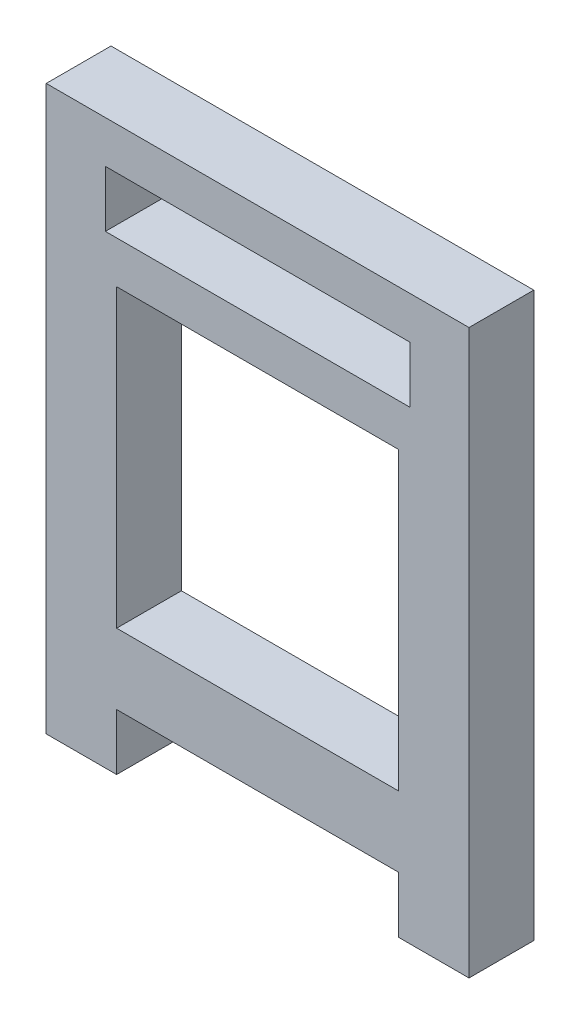
ISO-10303-21;
HEADER;
FILE_DESCRIPTION(('STEP AP214'),'2;1');
FILE_NAME('part.step','',(''),(''),'','','');
FILE_SCHEMA(('AUTOMOTIVE_DESIGN { 1 0 10303 214 1 1 1 1 }'));
ENDSEC;
DATA;
#1=APPLICATION_CONTEXT('core data for automotive mechanical design processes');
#2=APPLICATION_PROTOCOL_DEFINITION('international standard','automotive_design',2000,#1);
#3=PRODUCT_CONTEXT('',#1,'mechanical');
#4=PRODUCT('Part','Part','',(#3));
#5=PRODUCT_RELATED_PRODUCT_CATEGORY('part','',(#4));
#6=PRODUCT_DEFINITION_FORMATION('','',#4);
#7=PRODUCT_DEFINITION_CONTEXT('part definition',#1,'design');
#8=PRODUCT_DEFINITION('design','',#6,#7);
#9=PRODUCT_DEFINITION_SHAPE('','',#8);
#10=(LENGTH_UNIT() NAMED_UNIT(*) SI_UNIT(.MILLI.,.METRE.));
#11=(NAMED_UNIT(*) PLANE_ANGLE_UNIT() SI_UNIT($,.RADIAN.));
#12=(NAMED_UNIT(*) SI_UNIT($,.STERADIAN.) SOLID_ANGLE_UNIT());
#13=UNCERTAINTY_MEASURE_WITH_UNIT(LENGTH_MEASURE(1.E-05),#10,'distance_accuracy_value','');
#14=(GEOMETRIC_REPRESENTATION_CONTEXT(3) GLOBAL_UNCERTAINTY_ASSIGNED_CONTEXT((#13)) GLOBAL_UNIT_ASSIGNED_CONTEXT((#10,
#11,#12)) REPRESENTATION_CONTEXT('',''));
#15=CARTESIAN_POINT('',(0.,0.,0.));
#16=DIRECTION('',(0.,0.,1.));
#17=DIRECTION('',(1.,0.,0.));
#18=AXIS2_PLACEMENT_3D('',#15,#16,#17);
#19=CARTESIAN_POINT('',(0.,0.,2.3));
#20=DIRECTION('',(0.,0.,-1.));
#21=DIRECTION('',(-1.,0.,0.));
#22=AXIS2_PLACEMENT_3D('',#19,#20,#21);
#23=PLANE('',#22);
#24=DIRECTION('',(0.,1.,0.));
#25=VECTOR('',#24,1.);
#26=CARTESIAN_POINT('',(12.51,2.5,2.3));
#27=LINE('',#26,#25);
#28=CARTESIAN_POINT('',(12.51,2.5,2.3));
#29=VERTEX_POINT('',#28);
#30=CARTESIAN_POINT('',(12.51,13.,2.3));
#31=VERTEX_POINT('',#30);
#32=EDGE_CURVE('E188',#29,#31,#27,.T.);
#33=ORIENTED_EDGE('',*,*,#32,.F.);
#34=DIRECTION('',(1.,0.,0.));
#35=VECTOR('',#34,1.);
#36=CARTESIAN_POINT('',(2.5,2.5,2.3));
#37=LINE('',#36,#35);
#38=CARTESIAN_POINT('',(2.5,2.5,2.3));
#39=VERTEX_POINT('',#38);
#40=EDGE_CURVE('E196',#39,#29,#37,.T.);
#41=ORIENTED_EDGE('',*,*,#40,.F.);
#42=DIRECTION('',(0.,-1.,0.));
#43=VECTOR('',#42,1.);
#44=CARTESIAN_POINT('',(2.5,2.5,2.3));
#45=LINE('',#44,#43);
#46=CARTESIAN_POINT('',(2.5,13.,2.3));
#47=VERTEX_POINT('',#46);
#48=EDGE_CURVE('E193',#47,#39,#45,.T.);
#49=ORIENTED_EDGE('',*,*,#48,.F.);
#50=DIRECTION('',(-1.,0.,0.));
#51=VECTOR('',#50,1.);
#52=CARTESIAN_POINT('',(2.5,13.,2.3));
#53=LINE('',#52,#51);
#54=EDGE_CURVE('E190',#31,#47,#53,.T.);
#55=ORIENTED_EDGE('',*,*,#54,.F.);
#56=EDGE_LOOP('',(#33,#41,#49,#55));
#57=FACE_BOUND('',#56,.T.);
#58=DIRECTION('',(0.,-1.,0.));
#59=VECTOR('',#58,1.);
#60=CARTESIAN_POINT('',(0.,0.,2.3));
#61=LINE('',#60,#59);
#62=CARTESIAN_POINT('',(0.,18.,2.3));
#63=VERTEX_POINT('',#62);
#64=CARTESIAN_POINT('',(0.,-2.,2.3));
#65=VERTEX_POINT('',#64);
#66=EDGE_CURVE('E219',#63,#65,#61,.T.);
#67=ORIENTED_EDGE('',*,*,#66,.T.);
#68=DIRECTION('',(1.,0.,0.));
#69=VECTOR('',#68,1.);
#70=CARTESIAN_POINT('',(0.,-2.,2.3));
#71=LINE('',#70,#69);
#72=CARTESIAN_POINT('',(2.5,-2.,2.3));
#73=VERTEX_POINT('',#72);
#74=EDGE_CURVE('E221',#65,#73,#71,.T.);
#75=ORIENTED_EDGE('',*,*,#74,.T.);
#76=DIRECTION('',(0.,1.,0.));
#77=VECTOR('',#76,1.);
#78=CARTESIAN_POINT('',(2.5,-2.,2.3));
#79=LINE('',#78,#77);
#80=CARTESIAN_POINT('',(2.5,0.,2.3));
#81=VERTEX_POINT('',#80);
#82=EDGE_CURVE('E224',#73,#81,#79,.T.);
#83=ORIENTED_EDGE('',*,*,#82,.T.);
#84=DIRECTION('',(1.,0.,0.));
#85=VECTOR('',#84,1.);
#86=CARTESIAN_POINT('',(2.5,0.,2.3));
#87=LINE('',#86,#85);
#88=CARTESIAN_POINT('',(12.51,0.,2.3));
#89=VERTEX_POINT('',#88);
#90=EDGE_CURVE('E226',#81,#89,#87,.T.);
#91=ORIENTED_EDGE('',*,*,#90,.T.);
#92=DIRECTION('',(0.,-1.,0.));
#93=VECTOR('',#92,1.);
#94=CARTESIAN_POINT('',(12.51,-2.,2.3));
#95=LINE('',#94,#93);
#96=CARTESIAN_POINT('',(12.51,-2.,2.3));
#97=VERTEX_POINT('',#96);
#98=EDGE_CURVE('E228',#89,#97,#95,.T.);
#99=ORIENTED_EDGE('',*,*,#98,.T.);
#100=DIRECTION('',(1.,0.,0.));
#101=VECTOR('',#100,1.);
#102=CARTESIAN_POINT('',(15.01,-2.,2.3));
#103=LINE('',#102,#101);
#104=CARTESIAN_POINT('',(15.01,-2.,2.3));
#105=VERTEX_POINT('',#104);
#106=EDGE_CURVE('E230',#97,#105,#103,.T.);
#107=ORIENTED_EDGE('',*,*,#106,.T.);
#108=DIRECTION('',(0.,1.,0.));
#109=VECTOR('',#108,1.);
#110=CARTESIAN_POINT('',(15.01,0.,2.3));
#111=LINE('',#110,#109);
#112=CARTESIAN_POINT('',(15.01,18.,2.3));
#113=VERTEX_POINT('',#112);
#114=EDGE_CURVE('E232',#105,#113,#111,.T.);
#115=ORIENTED_EDGE('',*,*,#114,.T.);
#116=DIRECTION('',(-1.,0.,0.));
#117=VECTOR('',#116,1.);
#118=CARTESIAN_POINT('',(0.,18.,2.3));
#119=LINE('',#118,#117);
#120=EDGE_CURVE('E234',#113,#63,#119,.T.);
#121=ORIENTED_EDGE('',*,*,#120,.T.);
#122=EDGE_LOOP('',(#67,#75,#83,#91,#99,#107,#115,#121));
#123=FACE_BOUND('',#122,.T.);
#124=DIRECTION('',(0.,-1.,0.));
#125=VECTOR('',#124,1.);
#126=CARTESIAN_POINT('',(2.1,14.5,2.3));
#127=LINE('',#126,#125);
#128=CARTESIAN_POINT('',(2.1,16.5,2.3));
#129=VERTEX_POINT('',#128);
#130=CARTESIAN_POINT('',(2.1,14.5,2.3));
#131=VERTEX_POINT('',#130);
#132=EDGE_CURVE('E152',#129,#131,#127,.T.);
#133=ORIENTED_EDGE('',*,*,#132,.F.);
#134=DIRECTION('',(-1.,0.,0.));
#135=VECTOR('',#134,1.);
#136=CARTESIAN_POINT('',(2.1,16.5,2.3));
#137=LINE('',#136,#135);
#138=CARTESIAN_POINT('',(12.91,16.5,2.3));
#139=VERTEX_POINT('',#138);
#140=EDGE_CURVE('E174',#139,#129,#137,.T.);
#141=ORIENTED_EDGE('',*,*,#140,.F.);
#142=DIRECTION('',(0.,1.,0.));
#143=VECTOR('',#142,1.);
#144=CARTESIAN_POINT('',(12.91,14.5,2.3));
#145=LINE('',#144,#143);
#146=CARTESIAN_POINT('',(12.91,14.5,2.3));
#147=VERTEX_POINT('',#146);
#148=EDGE_CURVE('E172',#147,#139,#145,.T.);
#149=ORIENTED_EDGE('',*,*,#148,.F.);
#150=DIRECTION('',(1.,0.,0.));
#151=VECTOR('',#150,1.);
#152=CARTESIAN_POINT('',(2.1,14.5,2.3));
#153=LINE('',#152,#151);
#154=EDGE_CURVE('E160',#131,#147,#153,.T.);
#155=ORIENTED_EDGE('',*,*,#154,.F.);
#156=EDGE_LOOP('',(#133,#141,#149,#155));
#157=FACE_BOUND('',#156,.T.);
#158=ADVANCED_FACE('F39',(#57,#123,#157),#23,.F.);
#159=CARTESIAN_POINT('',(0.,0.,0.));
#160=DIRECTION('',(0.,0.,-1.));
#161=DIRECTION('',(-1.,0.,0.));
#162=AXIS2_PLACEMENT_3D('',#159,#160,#161);
#163=PLANE('',#162);
#164=DIRECTION('',(0.,-1.,0.));
#165=VECTOR('',#164,1.);
#166=CARTESIAN_POINT('',(0.,0.,0.));
#167=LINE('',#166,#165);
#168=CARTESIAN_POINT('',(0.,18.,0.));
#169=VERTEX_POINT('',#168);
#170=CARTESIAN_POINT('',(0.,-2.,0.));
#171=VERTEX_POINT('',#170);
#172=EDGE_CURVE('E218',#169,#171,#167,.T.);
#173=ORIENTED_EDGE('',*,*,#172,.F.);
#174=DIRECTION('',(-1.,0.,0.));
#175=VECTOR('',#174,1.);
#176=CARTESIAN_POINT('',(0.,18.,0.));
#177=LINE('',#176,#175);
#178=CARTESIAN_POINT('',(15.01,18.,0.));
#179=VERTEX_POINT('',#178);
#180=EDGE_CURVE('E222',#179,#169,#177,.T.);
#181=ORIENTED_EDGE('',*,*,#180,.F.);
#182=DIRECTION('',(0.,1.,0.));
#183=VECTOR('',#182,1.);
#184=CARTESIAN_POINT('',(15.01,0.,0.));
#185=LINE('',#184,#183);
#186=CARTESIAN_POINT('',(15.01,-2.,0.));
#187=VERTEX_POINT('',#186);
#188=EDGE_CURVE('E249',#187,#179,#185,.T.);
#189=ORIENTED_EDGE('',*,*,#188,.F.);
#190=DIRECTION('',(1.,0.,0.));
#191=VECTOR('',#190,1.);
#192=CARTESIAN_POINT('',(15.01,-2.,0.));
#193=LINE('',#192,#191);
#194=CARTESIAN_POINT('',(12.51,-2.,0.));
#195=VERTEX_POINT('',#194);
#196=EDGE_CURVE('E246',#195,#187,#193,.T.);
#197=ORIENTED_EDGE('',*,*,#196,.F.);
#198=DIRECTION('',(0.,-1.,0.));
#199=VECTOR('',#198,1.);
#200=CARTESIAN_POINT('',(12.51,-2.,0.));
#201=LINE('',#200,#199);
#202=CARTESIAN_POINT('',(12.51,0.,0.));
#203=VERTEX_POINT('',#202);
#204=EDGE_CURVE('E244',#203,#195,#201,.T.);
#205=ORIENTED_EDGE('',*,*,#204,.F.);
#206=DIRECTION('',(1.,0.,0.));
#207=VECTOR('',#206,1.);
#208=CARTESIAN_POINT('',(2.5,0.,0.));
#209=LINE('',#208,#207);
#210=CARTESIAN_POINT('',(2.5,0.,0.));
#211=VERTEX_POINT('',#210);
#212=EDGE_CURVE('E242',#211,#203,#209,.T.);
#213=ORIENTED_EDGE('',*,*,#212,.F.);
#214=DIRECTION('',(0.,1.,0.));
#215=VECTOR('',#214,1.);
#216=CARTESIAN_POINT('',(2.5,-2.,0.));
#217=LINE('',#216,#215);
#218=CARTESIAN_POINT('',(2.5,-2.,0.));
#219=VERTEX_POINT('',#218);
#220=EDGE_CURVE('E240',#219,#211,#217,.T.);
#221=ORIENTED_EDGE('',*,*,#220,.F.);
#222=DIRECTION('',(1.,0.,0.));
#223=VECTOR('',#222,1.);
#224=CARTESIAN_POINT('',(0.,-2.,0.));
#225=LINE('',#224,#223);
#226=EDGE_CURVE('E238',#171,#219,#225,.T.);
#227=ORIENTED_EDGE('',*,*,#226,.F.);
#228=EDGE_LOOP('',(#173,#181,#189,#197,#205,#213,#221,#227));
#229=FACE_BOUND('',#228,.T.);
#230=DIRECTION('',(1.,0.,0.));
#231=VECTOR('',#230,1.);
#232=CARTESIAN_POINT('',(2.5,2.5,0.));
#233=LINE('',#232,#231);
#234=CARTESIAN_POINT('',(2.5,2.5,0.));
#235=VERTEX_POINT('',#234);
#236=CARTESIAN_POINT('',(12.51,2.5,0.));
#237=VERTEX_POINT('',#236);
#238=EDGE_CURVE('E191',#235,#237,#233,.T.);
#239=ORIENTED_EDGE('',*,*,#238,.T.);
#240=DIRECTION('',(0.,1.,0.));
#241=VECTOR('',#240,1.);
#242=CARTESIAN_POINT('',(12.51,2.5,0.));
#243=LINE('',#242,#241);
#244=CARTESIAN_POINT('',(12.51,13.,0.));
#245=VERTEX_POINT('',#244);
#246=EDGE_CURVE('E168',#237,#245,#243,.T.);
#247=ORIENTED_EDGE('',*,*,#246,.T.);
#248=DIRECTION('',(-1.,0.,0.));
#249=VECTOR('',#248,1.);
#250=CARTESIAN_POINT('',(2.5,13.,0.));
#251=LINE('',#250,#249);
#252=CARTESIAN_POINT('',(2.5,13.,0.));
#253=VERTEX_POINT('',#252);
#254=EDGE_CURVE('E201',#245,#253,#251,.T.);
#255=ORIENTED_EDGE('',*,*,#254,.T.);
#256=DIRECTION('',(0.,-1.,0.));
#257=VECTOR('',#256,1.);
#258=CARTESIAN_POINT('',(2.5,2.5,0.));
#259=LINE('',#258,#257);
#260=EDGE_CURVE('E204',#253,#235,#259,.T.);
#261=ORIENTED_EDGE('',*,*,#260,.T.);
#262=EDGE_LOOP('',(#239,#247,#255,#261));
#263=FACE_BOUND('',#262,.T.);
#264=DIRECTION('',(-1.,0.,0.));
#265=VECTOR('',#264,1.);
#266=CARTESIAN_POINT('',(2.1,16.5,0.));
#267=LINE('',#266,#265);
#268=CARTESIAN_POINT('',(12.91,16.5,0.));
#269=VERTEX_POINT('',#268);
#270=CARTESIAN_POINT('',(2.1,16.5,0.));
#271=VERTEX_POINT('',#270);
#272=EDGE_CURVE('E161',#269,#271,#267,.T.);
#273=ORIENTED_EDGE('',*,*,#272,.T.);
#274=DIRECTION('',(0.,-1.,0.));
#275=VECTOR('',#274,1.);
#276=CARTESIAN_POINT('',(2.1,14.5,0.));
#277=LINE('',#276,#275);
#278=CARTESIAN_POINT('',(2.1,14.5,0.));
#279=VERTEX_POINT('',#278);
#280=EDGE_CURVE('E62',#271,#279,#277,.T.);
#281=ORIENTED_EDGE('',*,*,#280,.T.);
#282=DIRECTION('',(1.,0.,0.));
#283=VECTOR('',#282,1.);
#284=CARTESIAN_POINT('',(2.1,14.5,0.));
#285=LINE('',#284,#283);
#286=CARTESIAN_POINT('',(12.91,14.5,0.));
#287=VERTEX_POINT('',#286);
#288=EDGE_CURVE('E167',#279,#287,#285,.T.);
#289=ORIENTED_EDGE('',*,*,#288,.T.);
#290=DIRECTION('',(0.,1.,0.));
#291=VECTOR('',#290,1.);
#292=CARTESIAN_POINT('',(12.91,14.5,0.));
#293=LINE('',#292,#291);
#294=EDGE_CURVE('E180',#287,#269,#293,.T.);
#295=ORIENTED_EDGE('',*,*,#294,.T.);
#296=EDGE_LOOP('',(#273,#281,#289,#295));
#297=FACE_BOUND('',#296,.T.);
#298=ADVANCED_FACE('F281',(#229,#263,#297),#163,.T.);
#299=CARTESIAN_POINT('',(0.,0.,2.3));
#300=DIRECTION('',(1.,0.,0.));
#301=DIRECTION('',(0.,1.,0.));
#302=AXIS2_PLACEMENT_3D('',#299,#300,#301);
#303=PLANE('',#302);
#304=ORIENTED_EDGE('',*,*,#172,.T.);
#305=DIRECTION('',(0.,0.,-1.));
#306=VECTOR('',#305,1.);
#307=CARTESIAN_POINT('',(0.,-2.,2.3));
#308=LINE('',#307,#306);
#309=EDGE_CURVE('E11',#65,#171,#308,.T.);
#310=ORIENTED_EDGE('',*,*,#309,.F.);
#311=ORIENTED_EDGE('',*,*,#66,.F.);
#312=DIRECTION('',(0.,0.,-1.));
#313=VECTOR('',#312,1.);
#314=CARTESIAN_POINT('',(0.,18.,2.3));
#315=LINE('',#314,#313);
#316=EDGE_CURVE('E236',#63,#169,#315,.T.);
#317=ORIENTED_EDGE('',*,*,#316,.T.);
#318=EDGE_LOOP('',(#304,#310,#311,#317));
#319=FACE_BOUND('',#318,.T.);
#320=ADVANCED_FACE('F41',(#319),#303,.F.);
#321=CARTESIAN_POINT('',(0.,-2.,2.3));
#322=DIRECTION('',(0.,1.,0.));
#323=DIRECTION('',(0.,0.,1.));
#324=AXIS2_PLACEMENT_3D('',#321,#322,#323);
#325=PLANE('',#324);
#326=ORIENTED_EDGE('',*,*,#226,.T.);
#327=DIRECTION('',(0.,0.,-1.));
#328=VECTOR('',#327,1.);
#329=CARTESIAN_POINT('',(2.5,-2.,2.3));
#330=LINE('',#329,#328);
#331=EDGE_CURVE('E47',#73,#219,#330,.T.);
#332=ORIENTED_EDGE('',*,*,#331,.F.);
#333=ORIENTED_EDGE('',*,*,#74,.F.);
#334=ORIENTED_EDGE('',*,*,#309,.T.);
#335=EDGE_LOOP('',(#326,#332,#333,#334));
#336=FACE_BOUND('',#335,.T.);
#337=ADVANCED_FACE('F298',(#336),#325,.F.);
#338=CARTESIAN_POINT('',(2.5,-2.,2.3));
#339=DIRECTION('',(-1.,0.,0.));
#340=DIRECTION('',(0.,0.,1.));
#341=AXIS2_PLACEMENT_3D('',#338,#339,#340);
#342=PLANE('',#341);
#343=ORIENTED_EDGE('',*,*,#220,.T.);
#344=DIRECTION('',(0.,0.,-1.));
#345=VECTOR('',#344,1.);
#346=CARTESIAN_POINT('',(2.5,0.,2.3));
#347=LINE('',#346,#345);
#348=EDGE_CURVE('E267',#81,#211,#347,.T.);
#349=ORIENTED_EDGE('',*,*,#348,.F.);
#350=ORIENTED_EDGE('',*,*,#82,.F.);
#351=ORIENTED_EDGE('',*,*,#331,.T.);
#352=EDGE_LOOP('',(#343,#349,#350,#351));
#353=FACE_BOUND('',#352,.T.);
#354=ADVANCED_FACE('F274',(#353),#342,.F.);
#355=CARTESIAN_POINT('',(2.5,0.,2.3));
#356=DIRECTION('',(0.,1.,0.));
#357=DIRECTION('',(0.,0.,1.));
#358=AXIS2_PLACEMENT_3D('',#355,#356,#357);
#359=PLANE('',#358);
#360=ORIENTED_EDGE('',*,*,#212,.T.);
#361=DIRECTION('',(0.,0.,-1.));
#362=VECTOR('',#361,1.);
#363=CARTESIAN_POINT('',(12.51,0.,2.3));
#364=LINE('',#363,#362);
#365=EDGE_CURVE('E264',#89,#203,#364,.T.);
#366=ORIENTED_EDGE('',*,*,#365,.F.);
#367=ORIENTED_EDGE('',*,*,#90,.F.);
#368=ORIENTED_EDGE('',*,*,#348,.T.);
#369=EDGE_LOOP('',(#360,#366,#367,#368));
#370=FACE_BOUND('',#369,.T.);
#371=ADVANCED_FACE('F287',(#370),#359,.F.);
#372=CARTESIAN_POINT('',(12.51,-2.,2.3));
#373=DIRECTION('',(1.,0.,0.));
#374=DIRECTION('',(0.,0.,-1.));
#375=AXIS2_PLACEMENT_3D('',#372,#373,#374);
#376=PLANE('',#375);
#377=ORIENTED_EDGE('',*,*,#204,.T.);
#378=DIRECTION('',(0.,0.,-1.));
#379=VECTOR('',#378,1.);
#380=CARTESIAN_POINT('',(12.51,-2.,2.3));
#381=LINE('',#380,#379);
#382=EDGE_CURVE('E261',#97,#195,#381,.T.);
#383=ORIENTED_EDGE('',*,*,#382,.F.);
#384=ORIENTED_EDGE('',*,*,#98,.F.);
#385=ORIENTED_EDGE('',*,*,#365,.T.);
#386=EDGE_LOOP('',(#377,#383,#384,#385));
#387=FACE_BOUND('',#386,.T.);
#388=ADVANCED_FACE('F291',(#387),#376,.F.);
#389=CARTESIAN_POINT('',(15.01,-2.,2.3));
#390=DIRECTION('',(0.,1.,0.));
#391=DIRECTION('',(-1.,0.,0.));
#392=AXIS2_PLACEMENT_3D('',#389,#390,#391);
#393=PLANE('',#392);
#394=ORIENTED_EDGE('',*,*,#196,.T.);
#395=DIRECTION('',(0.,0.,-1.));
#396=VECTOR('',#395,1.);
#397=CARTESIAN_POINT('',(15.01,-2.,2.3));
#398=LINE('',#397,#396);
#399=EDGE_CURVE('E258',#105,#187,#398,.T.);
#400=ORIENTED_EDGE('',*,*,#399,.F.);
#401=ORIENTED_EDGE('',*,*,#106,.F.);
#402=ORIENTED_EDGE('',*,*,#382,.T.);
#403=EDGE_LOOP('',(#394,#400,#401,#402));
#404=FACE_BOUND('',#403,.T.);
#405=ADVANCED_FACE('F310',(#404),#393,.F.);
#406=CARTESIAN_POINT('',(15.01,0.,2.3));
#407=DIRECTION('',(-1.,0.,0.));
#408=DIRECTION('',(0.,0.,1.));
#409=AXIS2_PLACEMENT_3D('',#406,#407,#408);
#410=PLANE('',#409);
#411=ORIENTED_EDGE('',*,*,#188,.T.);
#412=DIRECTION('',(0.,0.,-1.));
#413=VECTOR('',#412,1.);
#414=CARTESIAN_POINT('',(15.01,18.,2.3));
#415=LINE('',#414,#413);
#416=EDGE_CURVE('E255',#113,#179,#415,.T.);
#417=ORIENTED_EDGE('',*,*,#416,.F.);
#418=ORIENTED_EDGE('',*,*,#114,.F.);
#419=ORIENTED_EDGE('',*,*,#399,.T.);
#420=EDGE_LOOP('',(#411,#417,#418,#419));
#421=FACE_BOUND('',#420,.T.);
#422=ADVANCED_FACE('F308',(#421),#410,.F.);
#423=CARTESIAN_POINT('',(0.,18.,2.3));
#424=DIRECTION('',(0.,-1.,0.));
#425=DIRECTION('',(0.,0.,-1.));
#426=AXIS2_PLACEMENT_3D('',#423,#424,#425);
#427=PLANE('',#426);
#428=ORIENTED_EDGE('',*,*,#180,.T.);
#429=ORIENTED_EDGE('',*,*,#316,.F.);
#430=ORIENTED_EDGE('',*,*,#120,.F.);
#431=ORIENTED_EDGE('',*,*,#416,.T.);
#432=EDGE_LOOP('',(#428,#429,#430,#431));
#433=FACE_BOUND('',#432,.T.);
#434=ADVANCED_FACE('F303',(#433),#427,.F.);
#435=CARTESIAN_POINT('',(12.51,2.5,2.3));
#436=DIRECTION('',(-1.,0.,0.));
#437=DIRECTION('',(0.,0.,1.));
#438=AXIS2_PLACEMENT_3D('',#435,#436,#437);
#439=PLANE('',#438);
#440=ORIENTED_EDGE('',*,*,#246,.F.);
#441=DIRECTION('',(0.,0.,-1.));
#442=VECTOR('',#441,1.);
#443=CARTESIAN_POINT('',(12.51,2.5,2.3));
#444=LINE('',#443,#442);
#445=EDGE_CURVE('E198',#29,#237,#444,.T.);
#446=ORIENTED_EDGE('',*,*,#445,.F.);
#447=ORIENTED_EDGE('',*,*,#32,.T.);
#448=DIRECTION('',(0.,0.,-1.));
#449=VECTOR('',#448,1.);
#450=CARTESIAN_POINT('',(12.51,13.,2.3));
#451=LINE('',#450,#449);
#452=EDGE_CURVE('E215',#31,#245,#451,.T.);
#453=ORIENTED_EDGE('',*,*,#452,.T.);
#454=EDGE_LOOP('',(#440,#446,#447,#453));
#455=FACE_BOUND('',#454,.T.);
#456=ADVANCED_FACE('F328',(#455),#439,.T.);
#457=CARTESIAN_POINT('',(2.5,13.,2.3));
#458=DIRECTION('',(0.,-1.,0.));
#459=DIRECTION('',(0.,0.,-1.));
#460=AXIS2_PLACEMENT_3D('',#457,#458,#459);
#461=PLANE('',#460);
#462=ORIENTED_EDGE('',*,*,#254,.F.);
#463=ORIENTED_EDGE('',*,*,#452,.F.);
#464=ORIENTED_EDGE('',*,*,#54,.T.);
#465=DIRECTION('',(0.,0.,-1.));
#466=VECTOR('',#465,1.);
#467=CARTESIAN_POINT('',(2.5,13.,2.3));
#468=LINE('',#467,#466);
#469=EDGE_CURVE('E213',#47,#253,#468,.T.);
#470=ORIENTED_EDGE('',*,*,#469,.T.);
#471=EDGE_LOOP('',(#462,#463,#464,#470));
#472=FACE_BOUND('',#471,.T.);
#473=ADVANCED_FACE('F335',(#472),#461,.T.);
#474=CARTESIAN_POINT('',(2.5,2.5,2.3));
#475=DIRECTION('',(1.,0.,0.));
#476=DIRECTION('',(0.,0.,-1.));
#477=AXIS2_PLACEMENT_3D('',#474,#475,#476);
#478=PLANE('',#477);
#479=ORIENTED_EDGE('',*,*,#260,.F.);
#480=ORIENTED_EDGE('',*,*,#469,.F.);
#481=ORIENTED_EDGE('',*,*,#48,.T.);
#482=DIRECTION('',(0.,0.,-1.));
#483=VECTOR('',#482,1.);
#484=CARTESIAN_POINT('',(2.5,2.5,2.3));
#485=LINE('',#484,#483);
#486=EDGE_CURVE('E211',#39,#235,#485,.T.);
#487=ORIENTED_EDGE('',*,*,#486,.T.);
#488=EDGE_LOOP('',(#479,#480,#481,#487));
#489=FACE_BOUND('',#488,.T.);
#490=ADVANCED_FACE('F340',(#489),#478,.T.);
#491=CARTESIAN_POINT('',(2.5,2.5,2.3));
#492=DIRECTION('',(0.,1.,0.));
#493=DIRECTION('',(0.,0.,1.));
#494=AXIS2_PLACEMENT_3D('',#491,#492,#493);
#495=PLANE('',#494);
#496=ORIENTED_EDGE('',*,*,#238,.F.);
#497=ORIENTED_EDGE('',*,*,#486,.F.);
#498=ORIENTED_EDGE('',*,*,#40,.T.);
#499=ORIENTED_EDGE('',*,*,#445,.T.);
#500=EDGE_LOOP('',(#496,#497,#498,#499));
#501=FACE_BOUND('',#500,.T.);
#502=ADVANCED_FACE('F346',(#501),#495,.T.);
#503=CARTESIAN_POINT('',(2.1,14.5,2.3));
#504=DIRECTION('',(1.,0.,0.));
#505=DIRECTION('',(0.,0.,-1.));
#506=AXIS2_PLACEMENT_3D('',#503,#504,#505);
#507=PLANE('',#506);
#508=ORIENTED_EDGE('',*,*,#280,.F.);
#509=DIRECTION('',(0.,0.,-1.));
#510=VECTOR('',#509,1.);
#511=CARTESIAN_POINT('',(2.1,16.5,2.3));
#512=LINE('',#511,#510);
#513=EDGE_CURVE('E156',#129,#271,#512,.T.);
#514=ORIENTED_EDGE('',*,*,#513,.F.);
#515=ORIENTED_EDGE('',*,*,#132,.T.);
#516=DIRECTION('',(0.,0.,-1.));
#517=VECTOR('',#516,1.);
#518=CARTESIAN_POINT('',(2.1,14.5,2.3));
#519=LINE('',#518,#517);
#520=EDGE_CURVE('E155',#131,#279,#519,.T.);
#521=ORIENTED_EDGE('',*,*,#520,.T.);
#522=EDGE_LOOP('',(#508,#514,#515,#521));
#523=FACE_BOUND('',#522,.T.);
#524=ADVANCED_FACE('F154',(#523),#507,.T.);
#525=CARTESIAN_POINT('',(2.1,14.5,2.3));
#526=DIRECTION('',(0.,1.,0.));
#527=DIRECTION('',(0.,0.,1.));
#528=AXIS2_PLACEMENT_3D('',#525,#526,#527);
#529=PLANE('',#528);
#530=ORIENTED_EDGE('',*,*,#288,.F.);
#531=ORIENTED_EDGE('',*,*,#520,.F.);
#532=ORIENTED_EDGE('',*,*,#154,.T.);
#533=DIRECTION('',(0.,0.,-1.));
#534=VECTOR('',#533,1.);
#535=CARTESIAN_POINT('',(12.91,14.5,2.3));
#536=LINE('',#535,#534);
#537=EDGE_CURVE('E169',#147,#287,#536,.T.);
#538=ORIENTED_EDGE('',*,*,#537,.T.);
#539=EDGE_LOOP('',(#530,#531,#532,#538));
#540=FACE_BOUND('',#539,.T.);
#541=ADVANCED_FACE('F164',(#540),#529,.T.);
#542=CARTESIAN_POINT('',(12.91,14.5,2.3));
#543=DIRECTION('',(-1.,0.,0.));
#544=DIRECTION('',(0.,0.,1.));
#545=AXIS2_PLACEMENT_3D('',#542,#543,#544);
#546=PLANE('',#545);
#547=ORIENTED_EDGE('',*,*,#294,.F.);
#548=ORIENTED_EDGE('',*,*,#537,.F.);
#549=ORIENTED_EDGE('',*,*,#148,.T.);
#550=DIRECTION('',(0.,0.,-1.));
#551=VECTOR('',#550,1.);
#552=CARTESIAN_POINT('',(12.91,16.5,2.3));
#553=LINE('',#552,#551);
#554=EDGE_CURVE('E54',#139,#269,#553,.T.);
#555=ORIENTED_EDGE('',*,*,#554,.T.);
#556=EDGE_LOOP('',(#547,#548,#549,#555));
#557=FACE_BOUND('',#556,.T.);
#558=ADVANCED_FACE('F365',(#557),#546,.T.);
#559=CARTESIAN_POINT('',(2.1,16.5,2.3));
#560=DIRECTION('',(0.,-1.,0.));
#561=DIRECTION('',(0.,0.,-1.));
#562=AXIS2_PLACEMENT_3D('',#559,#560,#561);
#563=PLANE('',#562);
#564=ORIENTED_EDGE('',*,*,#272,.F.);
#565=ORIENTED_EDGE('',*,*,#554,.F.);
#566=ORIENTED_EDGE('',*,*,#140,.T.);
#567=ORIENTED_EDGE('',*,*,#513,.T.);
#568=EDGE_LOOP('',(#564,#565,#566,#567));
#569=FACE_BOUND('',#568,.T.);
#570=ADVANCED_FACE('F368',(#569),#563,.T.);
#571=CLOSED_SHELL('',(#158,#298,#320,#337,#354,#371,#388,#405,#422,#434,#456,#473,#490,#502,
#524,#541,#558,#570));
#572=MANIFOLD_SOLID_BREP('B2',#571);
#573=ADVANCED_BREP_SHAPE_REPRESENTATION('',(#18,#572),#14);
#574=SHAPE_DEFINITION_REPRESENTATION(#9,#573);
ENDSEC;
END-ISO-10303-21;
